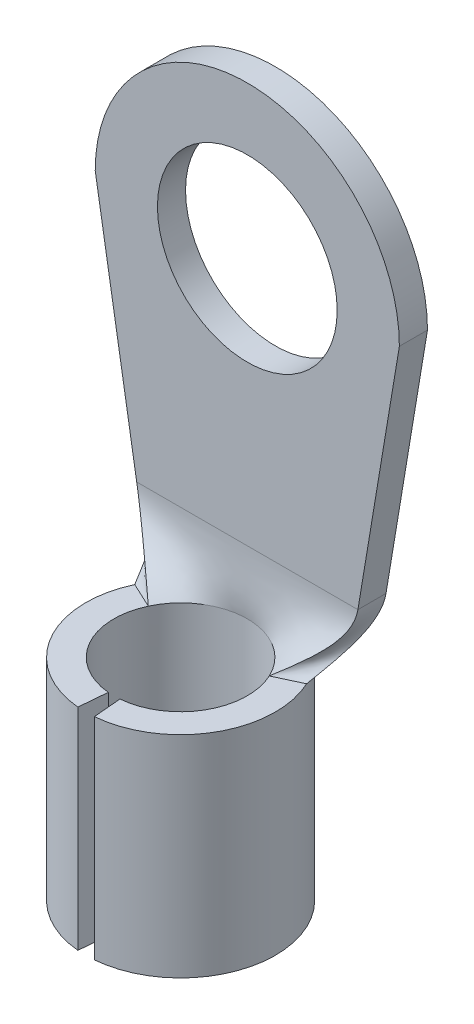
ISO-10303-21;
HEADER;
FILE_DESCRIPTION(('STEP AP214'),'2;1');
FILE_NAME('part.step','',(''),(''),'','','');
FILE_SCHEMA(('AUTOMOTIVE_DESIGN { 1 0 10303 214 1 1 1 1 }'));
ENDSEC;
DATA;
#1=APPLICATION_CONTEXT('core data for automotive mechanical design processes');
#2=APPLICATION_PROTOCOL_DEFINITION('international standard','automotive_design',2000,#1);
#3=PRODUCT_CONTEXT('',#1,'mechanical');
#4=PRODUCT('Part','Part','',(#3));
#5=PRODUCT_RELATED_PRODUCT_CATEGORY('part','',(#4));
#6=PRODUCT_DEFINITION_FORMATION('','',#4);
#7=PRODUCT_DEFINITION_CONTEXT('part definition',#1,'design');
#8=PRODUCT_DEFINITION('design','',#6,#7);
#9=PRODUCT_DEFINITION_SHAPE('','',#8);
#10=(LENGTH_UNIT() NAMED_UNIT(*) SI_UNIT(.MILLI.,.METRE.));
#11=(NAMED_UNIT(*) PLANE_ANGLE_UNIT() SI_UNIT($,.RADIAN.));
#12=(NAMED_UNIT(*) SI_UNIT($,.STERADIAN.) SOLID_ANGLE_UNIT());
#13=UNCERTAINTY_MEASURE_WITH_UNIT(LENGTH_MEASURE(1.E-05),#10,'distance_accuracy_value','');
#14=(GEOMETRIC_REPRESENTATION_CONTEXT(3) GLOBAL_UNCERTAINTY_ASSIGNED_CONTEXT((#13)) GLOBAL_UNIT_ASSIGNED_CONTEXT((#10,
#11,#12)) REPRESENTATION_CONTEXT('',''));
#15=CARTESIAN_POINT('',(0.,0.,0.));
#16=DIRECTION('',(0.,0.,1.));
#17=DIRECTION('',(1.,0.,0.));
#18=AXIS2_PLACEMENT_3D('',#15,#16,#17);
#19=CARTESIAN_POINT('',(5.35135135135135,-0.891891891891891,1.016));
#20=DIRECTION('',(-0.986393923832144,0.164398987305357,0.));
#21=DIRECTION('',(-0.164398987305357,-0.986393923832144,0.));
#22=AXIS2_PLACEMENT_3D('',#19,#20,#21);
#23=PLANE('',#22);
#24=DIRECTION('',(0.164398987305357,0.986393923832144,0.));
#25=VECTOR('',#24,1.);
#26=CARTESIAN_POINT('',(5.35135135135135,-0.891891891891891,0.));
#27=LINE('',#26,#25);
#28=CARTESIAN_POINT('',(4.,-9.,0.));
#29=VERTEX_POINT('',#28);
#30=CARTESIAN_POINT('',(5.5,0.,0.));
#31=VERTEX_POINT('',#30);
#32=EDGE_CURVE('E264',#29,#31,#27,.T.);
#33=ORIENTED_EDGE('',*,*,#32,.T.);
#34=DIRECTION('',(0.,0.,-1.));
#35=VECTOR('',#34,1.);
#36=CARTESIAN_POINT('',(5.5,0.,1.016));
#37=LINE('',#36,#35);
#38=CARTESIAN_POINT('',(5.5,0.,1.016));
#39=VERTEX_POINT('',#38);
#40=EDGE_CURVE('E208',#39,#31,#37,.T.);
#41=ORIENTED_EDGE('',*,*,#40,.F.);
#42=DIRECTION('',(0.164398987305357,0.986393923832144,0.));
#43=VECTOR('',#42,1.);
#44=CARTESIAN_POINT('',(5.35135135135135,-0.891891891891891,1.016));
#45=LINE('',#44,#43);
#46=CARTESIAN_POINT('',(4.,-9.,1.016));
#47=VERTEX_POINT('',#46);
#48=EDGE_CURVE('E297',#47,#39,#45,.T.);
#49=ORIENTED_EDGE('',*,*,#48,.F.);
#50=DIRECTION('',(0.,0.,-1.));
#51=VECTOR('',#50,1.);
#52=CARTESIAN_POINT('',(4.,-9.,1.016));
#53=LINE('',#52,#51);
#54=EDGE_CURVE('E278',#47,#29,#53,.T.);
#55=ORIENTED_EDGE('',*,*,#54,.T.);
#56=EDGE_LOOP('',(#33,#41,#49,#55));
#57=FACE_BOUND('',#56,.T.);
#58=ADVANCED_FACE('F57',(#57),#23,.F.);
#59=CARTESIAN_POINT('',(0.,0.,1.016));
#60=DIRECTION('',(0.,0.,-1.));
#61=DIRECTION('',(-1.,0.,0.));
#62=AXIS2_PLACEMENT_3D('',#59,#60,#61);
#63=CYLINDRICAL_SURFACE('',#62,5.5);
#64=CARTESIAN_POINT('',(0.,0.,0.));
#65=DIRECTION('',(0.,0.,1.));
#66=DIRECTION('',(1.,0.,0.));
#67=AXIS2_PLACEMENT_3D('',#64,#65,#66);
#68=CIRCLE('',#67,5.5);
#69=CARTESIAN_POINT('',(-5.5,0.,0.));
#70=VERTEX_POINT('',#69);
#71=EDGE_CURVE('E287',#31,#70,#68,.T.);
#72=ORIENTED_EDGE('',*,*,#71,.T.);
#73=DIRECTION('',(0.,0.,-1.));
#74=VECTOR('',#73,1.);
#75=CARTESIAN_POINT('',(-5.5,0.,1.016));
#76=LINE('',#75,#74);
#77=CARTESIAN_POINT('',(-5.5,0.,1.016));
#78=VERTEX_POINT('',#77);
#79=EDGE_CURVE('E212',#78,#70,#76,.T.);
#80=ORIENTED_EDGE('',*,*,#79,.F.);
#81=CARTESIAN_POINT('',(0.,0.,1.016));
#82=DIRECTION('',(0.,0.,1.));
#83=DIRECTION('',(1.,0.,0.));
#84=AXIS2_PLACEMENT_3D('',#81,#82,#83);
#85=CIRCLE('',#84,5.5);
#86=EDGE_CURVE('E296',#39,#78,#85,.T.);
#87=ORIENTED_EDGE('',*,*,#86,.F.);
#88=ORIENTED_EDGE('',*,*,#40,.T.);
#89=EDGE_LOOP('',(#72,#80,#87,#88));
#90=FACE_BOUND('',#89,.T.);
#91=ADVANCED_FACE('F323',(#90),#63,.T.);
#92=CARTESIAN_POINT('',(-5.35135135135135,-0.891891891891892,1.016));
#93=DIRECTION('',(-0.986393923832144,-0.164398987305357,0.));
#94=DIRECTION('',(0.164398987305357,-0.986393923832144,0.));
#95=AXIS2_PLACEMENT_3D('',#92,#93,#94);
#96=PLANE('',#95);
#97=DIRECTION('',(-0.164398987305357,0.986393923832144,0.));
#98=VECTOR('',#97,1.);
#99=CARTESIAN_POINT('',(-5.35135135135135,-0.891891891891892,0.));
#100=LINE('',#99,#98);
#101=CARTESIAN_POINT('',(-4.,-9.,0.));
#102=VERTEX_POINT('',#101);
#103=EDGE_CURVE('E284',#102,#70,#100,.T.);
#104=ORIENTED_EDGE('',*,*,#103,.F.);
#105=DIRECTION('',(0.,0.,-1.));
#106=VECTOR('',#105,1.);
#107=CARTESIAN_POINT('',(-4.,-9.,1.016));
#108=LINE('',#107,#106);
#109=CARTESIAN_POINT('',(-4.,-9.,1.016));
#110=VERTEX_POINT('',#109);
#111=EDGE_CURVE('E275',#110,#102,#108,.T.);
#112=ORIENTED_EDGE('',*,*,#111,.F.);
#113=DIRECTION('',(-0.164398987305357,0.986393923832144,0.));
#114=VECTOR('',#113,1.);
#115=CARTESIAN_POINT('',(-5.35135135135135,-0.891891891891892,1.016));
#116=LINE('',#115,#114);
#117=EDGE_CURVE('E293',#110,#78,#116,.T.);
#118=ORIENTED_EDGE('',*,*,#117,.T.);
#119=ORIENTED_EDGE('',*,*,#79,.T.);
#120=EDGE_LOOP('',(#104,#112,#118,#119));
#121=FACE_BOUND('',#120,.T.);
#122=ADVANCED_FACE('F320',(#121),#96,.T.);
#123=CARTESIAN_POINT('',(0.,0.,1.016));
#124=DIRECTION('',(0.,0.,-1.));
#125=DIRECTION('',(-1.,0.,0.));
#126=AXIS2_PLACEMENT_3D('',#123,#124,#125);
#127=CYLINDRICAL_SURFACE('',#126,3.25);
#128=CARTESIAN_POINT('',(0.,0.,1.016));
#129=DIRECTION('',(0.,0.,1.));
#130=DIRECTION('',(1.,0.,0.));
#131=AXIS2_PLACEMENT_3D('',#128,#129,#130);
#132=CIRCLE('',#131,3.25);
#133=CARTESIAN_POINT('',(3.25,0.,1.016));
#134=VERTEX_POINT('',#133);
#135=EDGE_CURVE('E246',#134,#134,#132,.T.);
#136=ORIENTED_EDGE('',*,*,#135,.T.);
#137=EDGE_LOOP('',(#136));
#138=FACE_BOUND('',#137,.T.);
#139=CARTESIAN_POINT('',(0.,0.,0.));
#140=DIRECTION('',(0.,0.,1.));
#141=DIRECTION('',(1.,0.,0.));
#142=AXIS2_PLACEMENT_3D('',#139,#140,#141);
#143=CIRCLE('',#142,3.25);
#144=CARTESIAN_POINT('',(3.25,0.,0.));
#145=VERTEX_POINT('',#144);
#146=EDGE_CURVE('E259',#145,#145,#143,.T.);
#147=ORIENTED_EDGE('',*,*,#146,.F.);
#148=EDGE_LOOP('',(#147));
#149=FACE_BOUND('',#148,.T.);
#150=ADVANCED_FACE('F306',(#138,#149),#127,.F.);
#151=CARTESIAN_POINT('',(0.,0.,1.016));
#152=DIRECTION('',(0.,0.,1.));
#153=DIRECTION('',(1.,0.,0.));
#154=AXIS2_PLACEMENT_3D('',#151,#152,#153);
#155=PLANE('',#154);
#156=ORIENTED_EDGE('',*,*,#135,.F.);
#157=EDGE_LOOP('',(#156));
#158=FACE_BOUND('',#157,.T.);
#159=ORIENTED_EDGE('',*,*,#48,.T.);
#160=ORIENTED_EDGE('',*,*,#86,.T.);
#161=ORIENTED_EDGE('',*,*,#117,.F.);
#162=DIRECTION('',(1.,0.,0.));
#163=VECTOR('',#162,1.);
#164=CARTESIAN_POINT('',(0.,-9.,1.016));
#165=LINE('',#164,#163);
#166=EDGE_CURVE('E280',#110,#47,#165,.T.);
#167=ORIENTED_EDGE('',*,*,#166,.T.);
#168=EDGE_LOOP('',(#159,#160,#161,#167));
#169=FACE_BOUND('',#168,.T.);
#170=ADVANCED_FACE('F309',(#158,#169),#155,.T.);
#171=CARTESIAN_POINT('',(0.,0.,0.));
#172=DIRECTION('',(0.,0.,1.));
#173=DIRECTION('',(1.,0.,0.));
#174=AXIS2_PLACEMENT_3D('',#171,#172,#173);
#175=PLANE('',#174);
#176=ORIENTED_EDGE('',*,*,#146,.T.);
#177=EDGE_LOOP('',(#176));
#178=FACE_BOUND('',#177,.T.);
#179=ORIENTED_EDGE('',*,*,#32,.F.);
#180=DIRECTION('',(1.,0.,0.));
#181=VECTOR('',#180,1.);
#182=CARTESIAN_POINT('',(0.,-9.,0.));
#183=LINE('',#182,#181);
#184=EDGE_CURVE('E281',#102,#29,#183,.T.);
#185=ORIENTED_EDGE('',*,*,#184,.F.);
#186=ORIENTED_EDGE('',*,*,#103,.T.);
#187=ORIENTED_EDGE('',*,*,#71,.F.);
#188=EDGE_LOOP('',(#179,#185,#186,#187));
#189=FACE_BOUND('',#188,.T.);
#190=ADVANCED_FACE('F311',(#178,#189),#175,.F.);
#191=CARTESIAN_POINT('',(4.,-9.,0.));
#192=CARTESIAN_POINT('',(3.82721398705067,-10.036716077696,0.));
#193=CARTESIAN_POINT('',(3.46747169439967,-10.661358038848,0.989920990245575));
#194=CARTESIAN_POINT('',(3.10772940174868,-11.286,1.97984198049115));
#195=CARTESIAN_POINT('',(4.,-9.,1.016));
#196=CARTESIAN_POINT('',(3.82281716997825,-10.0630969801305,1.016));
#197=CARTESIAN_POINT('',(3.00486893004885,-10.6745484900653,1.71261106720985));
#198=CARTESIAN_POINT('',(2.18692069011944,-11.286,2.4092221344197));
#199=B_SPLINE_SURFACE_WITH_KNOTS('',1,3,((#191,#192,#193,#194),(#195,#196,#197,#198)),
.UNSPECIFIED.,.F.,.F.,.F.,(2,2),(4,4),(0.,1.),(0.,1.),.UNSPECIFIED.);
#200=CARTESIAN_POINT('',(4.,-9.,1.016));
#201=CARTESIAN_POINT('',(3.82281716997825,-10.0630969801305,1.016));
#202=CARTESIAN_POINT('',(3.00486893004885,-10.6745484900653,1.71261106720985));
#203=CARTESIAN_POINT('',(2.18692069011944,-11.286,2.4092221344197));
#204=B_SPLINE_CURVE_WITH_KNOTS('',3,(#200,#201,#202,#203),.UNSPECIFIED.,.F.,.F.,(4,4),(0.,1.),.UNSPECIFIED.);
#205=CARTESIAN_POINT('',(2.18692069011944,-11.286,2.4092221344197));
#206=VERTEX_POINT('',#205);
#207=EDGE_CURVE('E256',#47,#206,#204,.T.);
#208=DIRECTION('',(-0.906307787036651,0.,0.422618261740697));
#209=VECTOR('',#208,1.);
#210=CARTESIAN_POINT('',(2.18692069011944,-11.286,2.4092221344197));
#211=LINE('',#210,#209);
#212=CARTESIAN_POINT('',(3.10772940174868,-11.286,1.97984198049115));
#213=VERTEX_POINT('',#212);
#214=EDGE_CURVE('E201',#213,#206,#211,.T.);
#215=CARTESIAN_POINT('',(4.,-9.,0.));
#216=CARTESIAN_POINT('',(3.82721398705067,-10.036716077696,0.));
#217=CARTESIAN_POINT('',(3.46747169439967,-10.661358038848,0.989920990245575));
#218=CARTESIAN_POINT('',(3.10772940174868,-11.286,1.97984198049115));
#219=B_SPLINE_CURVE_WITH_KNOTS('',3,(#215,#216,#217,#218),.UNSPECIFIED.,.F.,.F.,(4,4),(0.,1.),.UNSPECIFIED.);
#220=EDGE_CURVE('E224',#213,#29,#219,.F.);
#221=ORIENTED_EDGE('',*,*,#54,.F.);
#222=ORIENTED_EDGE('',*,*,#207,.T.);
#223=ORIENTED_EDGE('',*,*,#214,.F.);
#224=ORIENTED_EDGE('',*,*,#220,.T.);
#225=EDGE_LOOP('',(#221,#222,#223,#224));
#226=FACE_BOUND('',#225,.T.);
#227=ADVANCED_FACE('F317',(#226),#199,.T.);
#228=CARTESIAN_POINT('',(4.,-9.,1.016));
#229=CARTESIAN_POINT('',(3.82281716997825,-10.0630969801305,1.016));
#230=CARTESIAN_POINT('',(3.00486893004885,-10.6745484900653,1.71261106720985));
#231=CARTESIAN_POINT('',(2.18692069011944,-11.286,2.4092221344197));
#232=CARTESIAN_POINT('',(1.33333333333333,-9.,1.016));
#233=CARTESIAN_POINT('',(1.27427238999275,-10.0630969801305,1.016));
#234=CARTESIAN_POINT('',(1.25760185630457,-10.2918973435322,0.874735506767064));
#235=CARTESIAN_POINT('',(1.18517093190492,-11.286,0.26096284530987));
#236=CARTESIAN_POINT('',(-1.33333333333333,-9.,1.016));
#237=CARTESIAN_POINT('',(-1.27427238999275,-10.0630969801305,1.016));
#238=CARTESIAN_POINT('',(-1.25760185630456,-10.2918973435322,0.874735506767064));
#239=CARTESIAN_POINT('',(-1.18517093190492,-11.286,0.260962845309871));
#240=CARTESIAN_POINT('',(-4.,-9.,1.016));
#241=CARTESIAN_POINT('',(-3.82281716997825,-10.0630969801305,1.016));
#242=CARTESIAN_POINT('',(-3.00486893004884,-10.6745484900653,1.71261106720985));
#243=CARTESIAN_POINT('',(-2.18692069011944,-11.286,2.4092221344197));
#244=(BOUNDED_SURFACE() B_SPLINE_SURFACE(3,3,((#228,#229,#230,#231),(#232,#233,#234,#235),(#236,
#237,#238,#239),(#240,#241,#242,#243)),.UNSPECIFIED.,.F.,.F.,
.F.) B_SPLINE_SURFACE_WITH_KNOTS((4,4),(4,4),(0.,1.),(0.,1.),
.UNSPECIFIED.) GEOMETRIC_REPRESENTATION_ITEM() RATIONAL_B_SPLINE_SURFACE(((1.,1.,1.,1.),(1.,1.,
0.615078841160465,0.615078841160465),(1.,1.,0.615078841160465,0.615078841160465),(1.,1.,1.,1.))) REPRESENTATION_ITEM('') SURFACE());
#245=CARTESIAN_POINT('',(-4.,-9.,1.016));
#246=CARTESIAN_POINT('',(-3.82281716997825,-10.0630969801305,1.016));
#247=CARTESIAN_POINT('',(-3.00486893004884,-10.6745484900653,1.71261106720985));
#248=CARTESIAN_POINT('',(-2.18692069011944,-11.286,2.4092221344197));
#249=B_SPLINE_CURVE_WITH_KNOTS('',3,(#245,#246,#247,#248),.UNSPECIFIED.,.F.,.F.,(4,4),(0.,1.),.UNSPECIFIED.);
#250=CARTESIAN_POINT('',(-2.18692069011944,-11.286,2.4092221344197));
#251=VERTEX_POINT('',#250);
#252=EDGE_CURVE('E219',#110,#251,#249,.T.);
#253=CARTESIAN_POINT('',(0.,-11.286,3.429));
#254=DIRECTION('',(0.,1.,0.));
#255=DIRECTION('',(1.,0.,0.));
#256=AXIS2_PLACEMENT_3D('',#253,#254,#255);
#257=CIRCLE('',#256,2.413);
#258=EDGE_CURVE('E178',#206,#251,#257,.T.);
#259=ORIENTED_EDGE('',*,*,#166,.F.);
#260=ORIENTED_EDGE('',*,*,#252,.T.);
#261=ORIENTED_EDGE('',*,*,#258,.F.);
#262=ORIENTED_EDGE('',*,*,#207,.F.);
#263=EDGE_LOOP('',(#259,#260,#261,#262));
#264=FACE_BOUND('',#263,.T.);
#265=ADVANCED_FACE('F370',(#264),#244,.T.);
#266=CARTESIAN_POINT('',(-4.,-9.,0.));
#267=CARTESIAN_POINT('',(-3.82721398705066,-10.036716077696,0.));
#268=CARTESIAN_POINT('',(-3.46747169439967,-10.661358038848,0.989920990245576));
#269=CARTESIAN_POINT('',(-3.10772940174867,-11.286,1.97984198049115));
#270=CARTESIAN_POINT('',(-1.33333333333333,-9.,0.));
#271=CARTESIAN_POINT('',(-1.27573799568355,-10.036716077696,0.));
#272=CARTESIAN_POINT('',(-1.35215781610754,-10.2704522045768,-0.20074427985733));
#273=CARTESIAN_POINT('',(-1.68419027165436,-11.286,-1.07294753561229));
#274=CARTESIAN_POINT('',(1.33333333333333,-9.,0.));
#275=CARTESIAN_POINT('',(1.27573799568356,-10.036716077696,0.));
#276=CARTESIAN_POINT('',(1.35215781610754,-10.2704522045767,-0.20074427985733));
#277=CARTESIAN_POINT('',(1.68419027165436,-11.286,-1.07294753561229));
#278=CARTESIAN_POINT('',(4.,-9.,0.));
#279=CARTESIAN_POINT('',(3.82721398705067,-10.036716077696,0.));
#280=CARTESIAN_POINT('',(3.46747169439967,-10.661358038848,0.989920990245574));
#281=CARTESIAN_POINT('',(3.10772940174868,-11.286,1.97984198049115));
#282=(BOUNDED_SURFACE() B_SPLINE_SURFACE(3,3,((#266,#267,#268,#269),(#270,#271,#272,#273),(#274,
#275,#276,#277),(#278,#279,#280,#281)),.UNSPECIFIED.,.F.,.F.,
.F.) B_SPLINE_SURFACE_WITH_KNOTS((4,4),(4,4),(0.,1.),(0.,1.),
.UNSPECIFIED.) GEOMETRIC_REPRESENTATION_ITEM() RATIONAL_B_SPLINE_SURFACE(((1.,1.,1.,1.),(1.,1.,
0.615078841160465,0.615078841160465),(1.,1.,0.615078841160465,0.615078841160465),(1.,1.,1.,1.))) REPRESENTATION_ITEM('') SURFACE());
#283=CARTESIAN_POINT('',(0.,-11.286,3.429));
#284=DIRECTION('',(0.,-1.,0.));
#285=DIRECTION('',(1.,0.,0.));
#286=AXIS2_PLACEMENT_3D('',#283,#284,#285);
#287=CIRCLE('',#286,3.429);
#288=CARTESIAN_POINT('',(-3.10772940174867,-11.286,1.97984198049115));
#289=VERTEX_POINT('',#288);
#290=EDGE_CURVE('E192',#289,#213,#287,.T.);
#291=CARTESIAN_POINT('',(-4.,-9.,0.));
#292=CARTESIAN_POINT('',(-3.82721398705066,-10.036716077696,0.));
#293=CARTESIAN_POINT('',(-3.46747169439967,-10.661358038848,0.989920990245576));
#294=CARTESIAN_POINT('',(-3.10772940174867,-11.286,1.97984198049115));
#295=B_SPLINE_CURVE_WITH_KNOTS('',3,(#291,#292,#293,#294),.UNSPECIFIED.,.F.,.F.,(4,4),(0.,1.),.UNSPECIFIED.);
#296=EDGE_CURVE('E225',#289,#102,#295,.F.);
#297=ORIENTED_EDGE('',*,*,#184,.T.);
#298=ORIENTED_EDGE('',*,*,#220,.F.);
#299=ORIENTED_EDGE('',*,*,#290,.F.);
#300=ORIENTED_EDGE('',*,*,#296,.T.);
#301=EDGE_LOOP('',(#297,#298,#299,#300));
#302=FACE_BOUND('',#301,.T.);
#303=ADVANCED_FACE('F346',(#302),#282,.T.);
#304=CARTESIAN_POINT('',(-4.,-9.,1.016));
#305=CARTESIAN_POINT('',(-3.82281716997825,-10.0630969801305,1.016));
#306=CARTESIAN_POINT('',(-3.00486893004884,-10.6745484900653,1.71261106720985));
#307=CARTESIAN_POINT('',(-2.18692069011944,-11.286,2.4092221344197));
#308=CARTESIAN_POINT('',(-4.,-9.,0.));
#309=CARTESIAN_POINT('',(-3.82721398705066,-10.036716077696,0.));
#310=CARTESIAN_POINT('',(-3.46747169439967,-10.661358038848,0.989920990245575));
#311=CARTESIAN_POINT('',(-3.10772940174867,-11.286,1.97984198049115));
#312=B_SPLINE_SURFACE_WITH_KNOTS('',1,3,((#304,#305,#306,#307),(#308,#309,#310,#311)),
.UNSPECIFIED.,.F.,.F.,.F.,(2,2),(4,4),(0.,1.),(0.,1.),.UNSPECIFIED.);
#313=DIRECTION('',(-0.906307787036651,0.,-0.422618261740698));
#314=VECTOR('',#313,1.);
#315=CARTESIAN_POINT('',(-2.18692069011944,-11.286,2.4092221344197));
#316=LINE('',#315,#314);
#317=EDGE_CURVE('E235',#251,#289,#316,.T.);
#318=ORIENTED_EDGE('',*,*,#111,.T.);
#319=ORIENTED_EDGE('',*,*,#296,.F.);
#320=ORIENTED_EDGE('',*,*,#317,.F.);
#321=ORIENTED_EDGE('',*,*,#252,.F.);
#322=EDGE_LOOP('',(#318,#319,#320,#321));
#323=FACE_BOUND('',#322,.T.);
#324=ADVANCED_FACE('F344',(#323),#312,.T.);
#325=CARTESIAN_POINT('',(0.,-11.286,3.429));
#326=DIRECTION('',(0.,-1.,0.));
#327=DIRECTION('',(1.,0.,0.));
#328=AXIS2_PLACEMENT_3D('',#325,#326,#327);
#329=PLANE('',#328);
#330=CARTESIAN_POINT('',(0.,-11.286,3.429));
#331=DIRECTION('',(0.,1.,0.));
#332=DIRECTION('',(1.,0.,0.));
#333=AXIS2_PLACEMENT_3D('',#330,#331,#332);
#334=CIRCLE('',#333,2.413);
#335=CARTESIAN_POINT('',(-0.2103068072501,-11.286,5.83281780649538));
#336=VERTEX_POINT('',#335);
#337=EDGE_CURVE('E172',#251,#336,#334,.T.);
#338=ORIENTED_EDGE('',*,*,#337,.F.);
#339=ORIENTED_EDGE('',*,*,#317,.T.);
#340=CARTESIAN_POINT('',(0.,-11.286,3.429));
#341=DIRECTION('',(0.,-1.,0.));
#342=DIRECTION('',(1.,0.,0.));
#343=AXIS2_PLACEMENT_3D('',#340,#341,#342);
#344=CIRCLE('',#343,3.429);
#345=CARTESIAN_POINT('',(-0.298857041881718,-11.286,6.8449516197566));
#346=VERTEX_POINT('',#345);
#347=EDGE_CURVE('E183',#346,#289,#344,.T.);
#348=ORIENTED_EDGE('',*,*,#347,.F.);
#349=DIRECTION('',(-0.0871557427476551,0.,0.996194698091746));
#350=VECTOR('',#349,1.);
#351=CARTESIAN_POINT('',(-0.2103068072501,-11.286,5.83281780649538));
#352=LINE('',#351,#350);
#353=EDGE_CURVE('E152',#336,#346,#352,.T.);
#354=ORIENTED_EDGE('',*,*,#353,.F.);
#355=EDGE_LOOP('',(#338,#339,#348,#354));
#356=FACE_BOUND('',#355,.T.);
#357=ADVANCED_FACE('F349',(#356),#329,.F.);
#358=CARTESIAN_POINT('',(0.298857041881721,-11.286,6.8449516197566));
#359=VERTEX_POINT('',#358);
#360=EDGE_CURVE('E187',#213,#359,#344,.T.);
#361=ORIENTED_EDGE('',*,*,#360,.F.);
#362=ORIENTED_EDGE('',*,*,#214,.T.);
#363=CARTESIAN_POINT('',(0.210306807250101,-11.286,5.83281780649538));
#364=VERTEX_POINT('',#363);
#365=EDGE_CURVE('E175',#364,#206,#334,.T.);
#366=ORIENTED_EDGE('',*,*,#365,.F.);
#367=DIRECTION('',(-0.0871557427476584,0.,-0.996194698091746));
#368=VECTOR('',#367,1.);
#369=CARTESIAN_POINT('',(0.210306807250101,-11.286,5.83281780649538));
#370=LINE('',#369,#368);
#371=EDGE_CURVE('E146',#359,#364,#370,.T.);
#372=ORIENTED_EDGE('',*,*,#371,.F.);
#373=EDGE_LOOP('',(#361,#362,#366,#372));
#374=FACE_BOUND('',#373,.T.);
#375=ADVANCED_FACE('F199',(#374),#329,.F.);
#376=CARTESIAN_POINT('',(0.,-18.906,3.429));
#377=DIRECTION('',(0.,1.,0.));
#378=DIRECTION('',(-1.,0.,0.));
#379=AXIS2_PLACEMENT_3D('',#376,#377,#378);
#380=CYLINDRICAL_SURFACE('',#379,2.413);
#381=DIRECTION('',(0.,1.,0.));
#382=VECTOR('',#381,1.);
#383=CARTESIAN_POINT('',(-0.210306807250099,-18.906,5.83281780649538));
#384=LINE('',#383,#382);
#385=CARTESIAN_POINT('',(-0.210306807250099,-18.652,5.83281780649538));
#386=VERTEX_POINT('',#385);
#387=EDGE_CURVE('E156',#386,#336,#384,.T.);
#388=ORIENTED_EDGE('',*,*,#387,.F.);
#389=CARTESIAN_POINT('',(0.,-18.652,3.429));
#390=DIRECTION('',(0.,-1.,0.));
#391=DIRECTION('',(1.,0.,0.));
#392=AXIS2_PLACEMENT_3D('',#389,#390,#391);
#393=CIRCLE('',#392,2.413);
#394=CARTESIAN_POINT('',(0.210306807250102,-18.652,5.83281780649538));
#395=VERTEX_POINT('',#394);
#396=EDGE_CURVE('E65',#386,#395,#393,.T.);
#397=ORIENTED_EDGE('',*,*,#396,.T.);
#398=DIRECTION('',(0.,1.,0.));
#399=VECTOR('',#398,1.);
#400=CARTESIAN_POINT('',(0.210306807250102,-18.906,5.83281780649538));
#401=LINE('',#400,#399);
#402=EDGE_CURVE('E164',#395,#364,#401,.T.);
#403=ORIENTED_EDGE('',*,*,#402,.T.);
#404=ORIENTED_EDGE('',*,*,#365,.T.);
#405=ORIENTED_EDGE('',*,*,#258,.T.);
#406=ORIENTED_EDGE('',*,*,#337,.T.);
#407=EDGE_LOOP('',(#388,#397,#403,#404,#405,#406));
#408=FACE_BOUND('',#407,.T.);
#409=ADVANCED_FACE('F203',(#408),#380,.F.);
#410=CARTESIAN_POINT('',(-0.210306807250099,-18.906,5.83281780649538));
#411=DIRECTION('',(-0.996194698091746,0.,-0.0871557427476551));
#412=DIRECTION('',(-0.0871557427476551,0.,0.996194698091746));
#413=AXIS2_PLACEMENT_3D('',#410,#411,#412);
#414=PLANE('',#413);
#415=DIRECTION('',(-0.0871557427476551,0.,0.996194698091746));
#416=VECTOR('',#415,1.);
#417=CARTESIAN_POINT('',(-0.210306807250099,-18.906,5.83281780649538));
#418=LINE('',#417,#416);
#419=CARTESIAN_POINT('',(-0.232444365908003,-18.906,6.08585125981069));
#420=VERTEX_POINT('',#419);
#421=CARTESIAN_POINT('',(-0.298857041881716,-18.906,6.8449516197566));
#422=VERTEX_POINT('',#421);
#423=EDGE_CURVE('E137',#420,#422,#418,.T.);
#424=ORIENTED_EDGE('',*,*,#423,.F.);
#425=CARTESIAN_POINT('',(-0.232444365907992,-18.652,6.08585125981069));
#426=DIRECTION('',(-0.996194698091746,0.,-0.0871557427476551));
#427=DIRECTION('',(-0.0871557427476551,0.,0.996194698091746));
#428=AXIS2_PLACEMENT_3D('',#425,#426,#427);
#429=CIRCLE('',#428,0.254);
#430=EDGE_CURVE('E79',#420,#386,#429,.F.);
#431=ORIENTED_EDGE('',*,*,#430,.T.);
#432=ORIENTED_EDGE('',*,*,#387,.T.);
#433=ORIENTED_EDGE('',*,*,#353,.T.);
#434=DIRECTION('',(0.,1.,0.));
#435=VECTOR('',#434,1.);
#436=CARTESIAN_POINT('',(-0.298857041881716,-18.906,6.8449516197566));
#437=LINE('',#436,#435);
#438=EDGE_CURVE('E149',#422,#346,#437,.T.);
#439=ORIENTED_EDGE('',*,*,#438,.F.);
#440=EDGE_LOOP('',(#424,#431,#432,#433,#439));
#441=FACE_BOUND('',#440,.T.);
#442=ADVANCED_FACE('F150',(#441),#414,.F.);
#443=CARTESIAN_POINT('',(0.,-18.906,3.429));
#444=DIRECTION('',(0.,1.,0.));
#445=DIRECTION('',(-1.,0.,0.));
#446=AXIS2_PLACEMENT_3D('',#443,#444,#445);
#447=CYLINDRICAL_SURFACE('',#446,3.429);
#448=ORIENTED_EDGE('',*,*,#347,.T.);
#449=ORIENTED_EDGE('',*,*,#290,.T.);
#450=ORIENTED_EDGE('',*,*,#360,.T.);
#451=DIRECTION('',(0.,1.,0.));
#452=VECTOR('',#451,1.);
#453=CARTESIAN_POINT('',(0.298857041881723,-18.906,6.8449516197566));
#454=LINE('',#453,#452);
#455=CARTESIAN_POINT('',(0.298857041881723,-18.906,6.8449516197566));
#456=VERTEX_POINT('',#455);
#457=EDGE_CURVE('E157',#456,#359,#454,.T.);
#458=ORIENTED_EDGE('',*,*,#457,.F.);
#459=CARTESIAN_POINT('',(0.,-18.906,3.429));
#460=DIRECTION('',(0.,-1.,0.));
#461=DIRECTION('',(1.,0.,0.));
#462=AXIS2_PLACEMENT_3D('',#459,#460,#461);
#463=CIRCLE('',#462,3.429);
#464=EDGE_CURVE('E142',#422,#456,#463,.T.);
#465=ORIENTED_EDGE('',*,*,#464,.F.);
#466=ORIENTED_EDGE('',*,*,#438,.T.);
#467=EDGE_LOOP('',(#448,#449,#450,#458,#465,#466));
#468=FACE_BOUND('',#467,.T.);
#469=ADVANCED_FACE('F159',(#468),#447,.T.);
#470=CARTESIAN_POINT('',(0.210306807250102,-18.906,5.83281780649538));
#471=DIRECTION('',(0.996194698091745,0.,-0.0871557427476584));
#472=DIRECTION('',(-0.0871557427476584,0.,-0.996194698091746));
#473=AXIS2_PLACEMENT_3D('',#470,#471,#472);
#474=PLANE('',#473);
#475=ORIENTED_EDGE('',*,*,#402,.F.);
#476=CARTESIAN_POINT('',(0.232444365908009,-18.652,6.08585125981069));
#477=DIRECTION('',(0.996194698091745,0.,-0.0871557427476584));
#478=DIRECTION('',(-0.0871557427476584,0.,-0.996194698091746));
#479=AXIS2_PLACEMENT_3D('',#476,#477,#478);
#480=CIRCLE('',#479,0.254);
#481=CARTESIAN_POINT('',(0.232444365908008,-18.906,6.08585125981069));
#482=VERTEX_POINT('',#481);
#483=EDGE_CURVE('E12',#395,#482,#480,.F.);
#484=ORIENTED_EDGE('',*,*,#483,.T.);
#485=DIRECTION('',(-0.0871557427476584,0.,-0.996194698091746));
#486=VECTOR('',#485,1.);
#487=CARTESIAN_POINT('',(0.210306807250102,-18.906,5.83281780649538));
#488=LINE('',#487,#486);
#489=EDGE_CURVE('E162',#456,#482,#488,.T.);
#490=ORIENTED_EDGE('',*,*,#489,.F.);
#491=ORIENTED_EDGE('',*,*,#457,.T.);
#492=ORIENTED_EDGE('',*,*,#371,.T.);
#493=EDGE_LOOP('',(#475,#484,#490,#491,#492));
#494=FACE_BOUND('',#493,.T.);
#495=ADVANCED_FACE('F197',(#494),#474,.F.);
#496=CARTESIAN_POINT('',(0.,-18.906,3.429));
#497=DIRECTION('',(0.,-1.,0.));
#498=DIRECTION('',(1.,0.,0.));
#499=AXIS2_PLACEMENT_3D('',#496,#497,#498);
#500=PLANE('',#499);
#501=ORIENTED_EDGE('',*,*,#489,.T.);
#502=CARTESIAN_POINT('',(0.,-18.906,3.429));
#503=DIRECTION('',(0.,-1.,0.));
#504=DIRECTION('',(1.,0.,0.));
#505=AXIS2_PLACEMENT_3D('',#502,#503,#504);
#506=CIRCLE('',#505,2.667);
#507=EDGE_CURVE('E145',#482,#420,#506,.F.);
#508=ORIENTED_EDGE('',*,*,#507,.T.);
#509=ORIENTED_EDGE('',*,*,#423,.T.);
#510=ORIENTED_EDGE('',*,*,#464,.T.);
#511=EDGE_LOOP('',(#501,#508,#509,#510));
#512=FACE_BOUND('',#511,.T.);
#513=ADVANCED_FACE('F140',(#512),#500,.T.);
#514=CARTESIAN_POINT('',(0.,-18.652,3.429));
#515=DIRECTION('',(0.,-1.,0.));
#516=DIRECTION('',(1.,0.,0.));
#517=AXIS2_PLACEMENT_3D('',#514,#515,#516);
#518=TOROIDAL_SURFACE('',#517,2.667,0.254);
#519=ORIENTED_EDGE('',*,*,#483,.F.);
#520=ORIENTED_EDGE('',*,*,#396,.F.);
#521=ORIENTED_EDGE('',*,*,#430,.F.);
#522=ORIENTED_EDGE('',*,*,#507,.F.);
#523=EDGE_LOOP('',(#519,#520,#521,#522));
#524=FACE_BOUND('',#523,.T.);
#525=ADVANCED_FACE('F59',(#524),#518,.T.);
#526=CLOSED_SHELL('',(#58,#91,#122,#150,#170,#190,#227,#265,#303,#324,#357,#375,#409,#442,#469,
#495,#513,#525));
#527=MANIFOLD_SOLID_BREP('B2',#526);
#528=ADVANCED_BREP_SHAPE_REPRESENTATION('',(#18,#527),#14);
#529=SHAPE_DEFINITION_REPRESENTATION(#9,#528);
ENDSEC;
END-ISO-10303-21;
